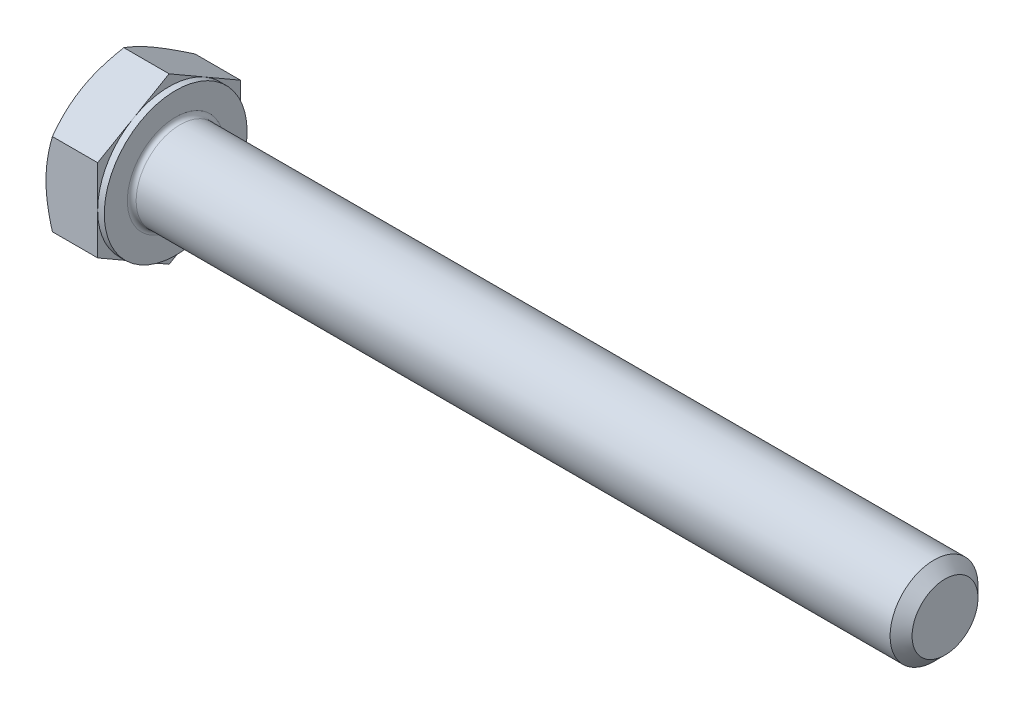
ISO-10303-21;
HEADER;
FILE_DESCRIPTION(('STEP AP214'),'2;1');
FILE_NAME('part.step','',(''),(''),'','','');
FILE_SCHEMA(('AUTOMOTIVE_DESIGN { 1 0 10303 214 1 1 1 1 }'));
ENDSEC;
DATA;
#1=APPLICATION_CONTEXT('core data for automotive mechanical design processes');
#2=APPLICATION_PROTOCOL_DEFINITION('international standard','automotive_design',2000,#1);
#3=PRODUCT_CONTEXT('',#1,'mechanical');
#4=PRODUCT('Part','Part','',(#3));
#5=PRODUCT_RELATED_PRODUCT_CATEGORY('part','',(#4));
#6=PRODUCT_DEFINITION_FORMATION('','',#4);
#7=PRODUCT_DEFINITION_CONTEXT('part definition',#1,'design');
#8=PRODUCT_DEFINITION('design','',#6,#7);
#9=PRODUCT_DEFINITION_SHAPE('','',#8);
#10=(LENGTH_UNIT() NAMED_UNIT(*) SI_UNIT(.MILLI.,.METRE.));
#11=(NAMED_UNIT(*) PLANE_ANGLE_UNIT() SI_UNIT($,.RADIAN.));
#12=(NAMED_UNIT(*) SI_UNIT($,.STERADIAN.) SOLID_ANGLE_UNIT());
#13=UNCERTAINTY_MEASURE_WITH_UNIT(LENGTH_MEASURE(1.E-05),#10,'distance_accuracy_value','');
#14=(GEOMETRIC_REPRESENTATION_CONTEXT(3) GLOBAL_UNCERTAINTY_ASSIGNED_CONTEXT((#13)) GLOBAL_UNIT_ASSIGNED_CONTEXT((#10,
#11,#12)) REPRESENTATION_CONTEXT('',''));
#15=CARTESIAN_POINT('',(0.,0.,0.));
#16=DIRECTION('',(0.,0.,1.));
#17=DIRECTION('',(1.,0.,0.));
#18=AXIS2_PLACEMENT_3D('',#15,#16,#17);
#19=CARTESIAN_POINT('',(5.3,3.75277674973256,-6.5));
#20=DIRECTION('',(0.,-0.866025403784438,0.500000000000001));
#21=DIRECTION('',(0.,-0.500000000000001,-0.866025403784438));
#22=AXIS2_PLACEMENT_3D('',#19,#20,#21);
#23=PLANE('',#22);
#24=DIRECTION('',(0.,0.500000000000001,0.866025403784438));
#25=VECTOR('',#24,1.);
#26=CARTESIAN_POINT('',(4.7,3.75277674973256,-6.5));
#27=LINE('',#26,#25);
#28=CARTESIAN_POINT('',(4.7,3.75277674973256,-6.5));
#29=VERTEX_POINT('',#28);
#30=CARTESIAN_POINT('',(4.7,5.62916512459885,-3.25));
#31=VERTEX_POINT('',#30);
#32=EDGE_CURVE('E178',#29,#31,#27,.T.);
#33=ORIENTED_EDGE('',*,*,#32,.F.);
#34=DIRECTION('',(-1.,0.,0.));
#35=VECTOR('',#34,1.);
#36=CARTESIAN_POINT('',(5.3,3.75277674973256,-6.5));
#37=LINE('',#36,#35);
#38=CARTESIAN_POINT('',(0.580556583600761,3.75277674973256,-6.5));
#39=VERTEX_POINT('',#38);
#40=EDGE_CURVE('E306',#29,#39,#37,.T.);
#41=ORIENTED_EDGE('',*,*,#40,.T.);
#42=CARTESIAN_POINT('',(0.580623251805869,7.50566896951898,0.0002));
#43=CARTESIAN_POINT('',(0.533004423075487,7.4231786300702,-0.14267745905888));
#44=CARTESIAN_POINT('',(0.487546700602708,7.34038072665458,-0.286087634534913));
#45=CARTESIAN_POINT('',(0.401548682023047,7.17411251123976,-0.574072631317195));
#46=CARTESIAN_POINT('',(0.361010507228027,7.09064192560665,-0.718647926571264));
#47=CARTESIAN_POINT('',(0.24757100112321,6.83889369625719,-1.15468865052003));
#48=CARTESIAN_POINT('',(0.183047807128741,6.66962231516081,-1.44787528284632));
#49=CARTESIAN_POINT('',(0.107386583547492,6.41631077211555,-1.88662374554437));
#50=CARTESIAN_POINT('',(0.0858328564569881,6.33302748139454,-2.03087463649469));
#51=CARTESIAN_POINT('',(0.0496903146061193,6.16608458377293,-2.32002821713809));
#52=CARTESIAN_POINT('',(0.0351008844596669,6.08242501078143,-2.46493084809889));
#53=CARTESIAN_POINT('',(0.0132587525073471,5.91496056339806,-2.75498777942832));
#54=CARTESIAN_POINT('',(0.00599772432210794,5.8311559625217,-2.90014160605421));
#55=CARTESIAN_POINT('',(-0.00103969741776869,5.66347396979287,-3.19057533697495));
#56=CARTESIAN_POINT('',(-0.000816322187795487,5.5795965802691,-3.33585523723636));
#57=CARTESIAN_POINT('',(0.010083458515165,5.34979921898453,-3.73387594242649));
#58=CARTESIAN_POINT('',(0.028381817869413,5.20395446807007,-3.98648646102757));
#59=CARTESIAN_POINT('',(0.0864063414576743,4.91323365606635,-4.49002967823568));
#60=CARTESIAN_POINT('',(0.126152338538243,4.76835861741226,-4.74096060593308));
#61=CARTESIAN_POINT('',(0.225505903202148,4.47705272008731,-5.24551722064432));
#62=CARTESIAN_POINT('',(0.285534425638025,4.33065861912702,-5.49907924143591));
#63=CARTESIAN_POINT('',(0.421774992509866,4.04005357906493,-6.00242193575904));
#64=CARTESIAN_POINT('',(0.497955034163591,3.89583891821181,-6.25220905555296));
#65=CARTESIAN_POINT('',(0.580623251805865,3.75266127967873,-6.5002));
#66=B_SPLINE_CURVE_WITH_KNOTS('',3,(#42,#43,#44,#45,#46,#47,#48,#49,#50,#51,#52,#53,#54,#55,#56,
#57,#58,#59,#60,#61,#62,#63,#64,#65),.UNSPECIFIED.,.F.,.F.,(4,2,2,2,2,2,2,2,2,2,2,4),(0.,
0.515105052395588,1.03043143507525,2.06322554824262,2.56697389547996,3.07067772176454,
3.57380860368928,4.0769239424252,4.9527935470566,5.82947446853466,6.72559912449737,
7.61996451221046),.UNSPECIFIED.);
#67=CARTESIAN_POINT('',(0.,5.62916512459885,-3.25000000000001));
#68=VERTEX_POINT('',#67);
#69=EDGE_CURVE('E233',#68,#39,#66,.T.);
#70=ORIENTED_EDGE('',*,*,#69,.F.);
#71=CARTESIAN_POINT('',(0.580556583600765,7.50555349946514,0.));
#72=VERTEX_POINT('',#71);
#73=EDGE_CURVE('E69',#72,#68,#66,.T.);
#74=ORIENTED_EDGE('',*,*,#73,.F.);
#75=DIRECTION('',(-1.,0.,0.));
#76=VECTOR('',#75,1.);
#77=CARTESIAN_POINT('',(5.3,7.50555349946514,0.));
#78=LINE('',#77,#76);
#79=CARTESIAN_POINT('',(4.7,7.50555349946514,0.));
#80=VERTEX_POINT('',#79);
#81=EDGE_CURVE('E298',#80,#72,#78,.T.);
#82=ORIENTED_EDGE('',*,*,#81,.F.);
#83=EDGE_CURVE('E176',#31,#80,#27,.T.);
#84=ORIENTED_EDGE('',*,*,#83,.F.);
#85=EDGE_LOOP('',(#33,#41,#70,#74,#82,#84));
#86=FACE_BOUND('',#85,.T.);
#87=ADVANCED_FACE('F46',(#86),#23,.F.);
#88=CARTESIAN_POINT('',(5.3,7.50555349946514,0.));
#89=DIRECTION('',(0.,-0.866025403784438,-0.500000000000001));
#90=DIRECTION('',(0.,0.500000000000001,-0.866025403784438));
#91=AXIS2_PLACEMENT_3D('',#88,#89,#90);
#92=PLANE('',#91);
#93=DIRECTION('',(0.,-0.500000000000001,0.866025403784438));
#94=VECTOR('',#93,1.);
#95=CARTESIAN_POINT('',(4.7,7.50555349946514,0.));
#96=LINE('',#95,#94);
#97=CARTESIAN_POINT('',(4.7,5.62916512459885,3.25000000000001));
#98=VERTEX_POINT('',#97);
#99=EDGE_CURVE('E175',#80,#98,#96,.T.);
#100=ORIENTED_EDGE('',*,*,#99,.F.);
#101=ORIENTED_EDGE('',*,*,#81,.T.);
#102=CARTESIAN_POINT('',(0.580623251805865,3.75266127967872,6.5002));
#103=CARTESIAN_POINT('',(0.533004423075483,3.8351516191275,6.35732254094112));
#104=CARTESIAN_POINT('',(0.487546700602704,3.91794952254312,6.21391236546509));
#105=CARTESIAN_POINT('',(0.401548682023044,4.08421773795794,5.9259273686828));
#106=CARTESIAN_POINT('',(0.361010507228023,4.16768832359105,5.78135207342873));
#107=CARTESIAN_POINT('',(0.247571001123207,4.41943655294051,5.34531134947996));
#108=CARTESIAN_POINT('',(0.183047807128738,4.58870793403689,5.05212471715368));
#109=CARTESIAN_POINT('',(0.10738658354749,4.84201947708215,4.61337625445563));
#110=CARTESIAN_POINT('',(0.0858328564569865,4.92530276780316,4.46912536350531));
#111=CARTESIAN_POINT('',(0.0496903146061183,5.09224566542477,4.17997178286191));
#112=CARTESIAN_POINT('',(0.035100884459666,5.17590523841627,4.03506915190111));
#113=CARTESIAN_POINT('',(0.0132587525073465,5.34336968579964,3.74501222057168));
#114=CARTESIAN_POINT('',(0.00599772432210779,5.427174286676,3.59985839394579));
#115=CARTESIAN_POINT('',(-0.00103969741776854,5.59485627940483,3.30942466302505));
#116=CARTESIAN_POINT('',(-0.000816322187795452,5.6787336689286,3.16414476276364));
#117=CARTESIAN_POINT('',(0.010083458515165,5.90853103021317,2.76612405757351));
#118=CARTESIAN_POINT('',(0.0283818178694132,6.05437578112763,2.51351353897243));
#119=CARTESIAN_POINT('',(0.0864063414576753,6.34509659313135,2.00997032176432));
#120=CARTESIAN_POINT('',(0.126152338538245,6.48997163178545,1.75903939406692));
#121=CARTESIAN_POINT('',(0.22550590320215,6.78127752911039,1.25448277935568));
#122=CARTESIAN_POINT('',(0.285534425638028,6.92767163007068,1.00092075856409));
#123=CARTESIAN_POINT('',(0.42177499250987,7.21827667013277,0.497578064240955));
#124=CARTESIAN_POINT('',(0.497955034163595,7.36249133098589,0.247790944447036));
#125=CARTESIAN_POINT('',(0.580623251805869,7.50566896951898,-0.000200000000000213));
#126=B_SPLINE_CURVE_WITH_KNOTS('',3,(#102,#103,#104,#105,#106,#107,#108,#109,#110,#111,#112,
#113,#114,#115,#116,#117,#118,#119,#120,#121,#122,#123,#124,#125),.UNSPECIFIED.,.F.,.F.,(4,2,2,
2,2,2,2,2,2,2,2,4),(0.,0.515105052395587,1.03043143507524,2.06322554824262,2.56697389547996,
3.07067772176454,3.57380860368928,4.0769239424252,4.9527935470566,5.82947446853466,
6.72559912449737,7.61996451221046),.UNSPECIFIED.);
#127=CARTESIAN_POINT('',(0.,5.62916512459885,3.25000000000001));
#128=VERTEX_POINT('',#127);
#129=EDGE_CURVE('E230',#128,#72,#126,.T.);
#130=ORIENTED_EDGE('',*,*,#129,.F.);
#131=CARTESIAN_POINT('',(0.58055658360076,3.75277674973256,6.5));
#132=VERTEX_POINT('',#131);
#133=EDGE_CURVE('E244',#132,#128,#126,.T.);
#134=ORIENTED_EDGE('',*,*,#133,.F.);
#135=DIRECTION('',(-1.,0.,0.));
#136=VECTOR('',#135,1.);
#137=CARTESIAN_POINT('',(5.3,3.75277674973256,6.5));
#138=LINE('',#137,#136);
#139=CARTESIAN_POINT('',(4.7,3.75277674973256,6.5));
#140=VERTEX_POINT('',#139);
#141=EDGE_CURVE('E300',#140,#132,#138,.T.);
#142=ORIENTED_EDGE('',*,*,#141,.F.);
#143=EDGE_CURVE('E143',#98,#140,#96,.T.);
#144=ORIENTED_EDGE('',*,*,#143,.F.);
#145=EDGE_LOOP('',(#100,#101,#130,#134,#142,#144));
#146=FACE_BOUND('',#145,.T.);
#147=ADVANCED_FACE('F251',(#146),#92,.F.);
#148=CARTESIAN_POINT('',(5.3,3.75277674973256,6.5));
#149=DIRECTION('',(0.,0.,-1.));
#150=DIRECTION('',(0.,1.,0.));
#151=AXIS2_PLACEMENT_3D('',#148,#149,#150);
#152=PLANE('',#151);
#153=DIRECTION('',(0.,-1.,0.));
#154=VECTOR('',#153,1.);
#155=CARTESIAN_POINT('',(4.7,3.75277674973256,6.5));
#156=LINE('',#155,#154);
#157=CARTESIAN_POINT('',(4.7,0.,6.5));
#158=VERTEX_POINT('',#157);
#159=EDGE_CURVE('E137',#140,#158,#156,.T.);
#160=ORIENTED_EDGE('',*,*,#159,.F.);
#161=ORIENTED_EDGE('',*,*,#141,.T.);
#162=CARTESIAN_POINT('',(3.18835311590246,-10.1137456678934,6.5));
#163=CARTESIAN_POINT('',(3.05034774010468,-9.82952666322138,6.5));
#164=CARTESIAN_POINT('',(2.91365616489938,-9.54465869649274,6.5));
#165=CARTESIAN_POINT('',(2.64363899497541,-8.97327978057922,6.5));
#166=CARTESIAN_POINT('',(2.51031392459097,-8.68676858388472,6.5));
#167=CARTESIAN_POINT('',(2.24710473482719,-8.11029837842689,6.5));
#168=CARTESIAN_POINT('',(2.1172430043868,-7.82032911201512,6.5));
#169=CARTESIAN_POINT('',(1.86279082826903,-7.2380954102234,6.5));
#170=CARTESIAN_POINT('',(1.73820013554674,-6.94583108317207,6.5));
#171=CARTESIAN_POINT('',(1.49176685426961,-6.34906440963036,6.5));
#172=CARTESIAN_POINT('',(1.37014257641265,-6.04447142288872,6.5));
#173=CARTESIAN_POINT('',(1.13601865758149,-5.43173420957315,6.5));
#174=CARTESIAN_POINT('',(1.02352003558022,-5.12358959079846,6.5));
#175=CARTESIAN_POINT('',(0.810575368239917,-4.5038256978226,6.5));
#176=CARTESIAN_POINT('',(0.710105232302005,-4.19221478266993,6.5));
#177=CARTESIAN_POINT('',(0.524420166144454,-3.56452019206012,6.5));
#178=CARTESIAN_POINT('',(0.439200468206418,-3.24843794792921,6.5));
#179=CARTESIAN_POINT('',(0.288524223401198,-2.61335465712783,6.5));
#180=CARTESIAN_POINT('',(0.222961865744749,-2.29437912059505,6.5));
#181=CARTESIAN_POINT('',(0.115312883130725,-1.65238219405863,6.5));
#182=CARTESIAN_POINT('',(0.0732239014690639,-1.3293612135443,6.5));
#183=CARTESIAN_POINT('',(0.0304887136381667,-0.845231171839986,6.5));
#184=CARTESIAN_POINT('',(0.0196493434273843,-0.684982209663103,6.5));
#185=CARTESIAN_POINT('',(0.00475298486143982,-0.36416234906546,6.5));
#186=CARTESIAN_POINT('',(0.000695882908832042,-0.203591456081879,6.5));
#187=CARTESIAN_POINT('',(-0.000531597190094996,0.117577430374297,6.5));
#188=CARTESIAN_POINT('',(0.00229809017012694,0.278175424090143,6.5));
#189=CARTESIAN_POINT('',(0.0147726845547639,0.599108972823505,6.5));
#190=CARTESIAN_POINT('',(0.0244179260500518,0.759444514574217,6.5));
#191=CARTESIAN_POINT('',(0.0554961939343001,1.14369946602534,6.5));
#192=CARTESIAN_POINT('',(0.0801030490514518,1.36736763045086,6.5));
#193=CARTESIAN_POINT('',(0.141246537453378,1.81305591311688,6.5));
#194=CARTESIAN_POINT('',(0.177784759614452,2.03507580783108,6.5));
#195=CARTESIAN_POINT('',(0.303360001332115,2.69839633433796,6.5));
#196=CARTESIAN_POINT('',(0.408335815147595,3.13672010374357,6.5));
#197=CARTESIAN_POINT('',(0.59056459313494,3.79232112918118,6.5));
#198=CARTESIAN_POINT('',(0.656313198979091,4.01299150874073,6.5));
#199=CARTESIAN_POINT('',(0.794681634200732,4.45218859008391,6.5));
#200=CARTESIAN_POINT('',(0.867301513122617,4.67071527639819,6.5));
#201=CARTESIAN_POINT('',(1.01824353854295,5.10569490252726,6.5));
#202=CARTESIAN_POINT('',(1.09656388232839,5.32214847365075,6.5));
#203=CARTESIAN_POINT('',(1.25798086164821,5.75325725773039,6.5));
#204=CARTESIAN_POINT('',(1.34107741035995,5.96791250329556,6.5));
#205=CARTESIAN_POINT('',(1.56029019583041,6.51888445936372,6.5));
#206=CARTESIAN_POINT('',(1.69936356666534,6.85402316813627,6.5));
#207=CARTESIAN_POINT('',(1.98501958087353,7.52109583939393,6.5));
#208=CARTESIAN_POINT('',(2.13160288780791,7.85302951559933,6.5));
#209=CARTESIAN_POINT('',(2.43059748044951,8.51437865518657,6.5));
#210=CARTESIAN_POINT('',(2.58301057596959,8.84379329784093,6.5));
#211=CARTESIAN_POINT('',(2.89234869374926,9.50047798683784,6.5));
#212=CARTESIAN_POINT('',(3.04927357220058,9.82774810112757,6.5));
#213=CARTESIAN_POINT('',(3.36692013130636,10.4809971975748,6.5));
#214=CARTESIAN_POINT('',(3.52764676491733,10.8069737667408,6.5));
#215=CARTESIAN_POINT('',(3.85198555554899,11.4574882901034,6.5));
#216=CARTESIAN_POINT('',(4.01559773123065,11.7820262349792,6.5));
#217=CARTESIAN_POINT('',(4.50986185003773,12.7537468114441,6.5));
#218=CARTESIAN_POINT('',(4.84399997978541,13.3991555932469,6.5));
#219=CARTESIAN_POINT('',(5.48575990265919,14.6239779290894,6.5));
#220=CARTESIAN_POINT('',(5.79279643372278,15.2036995760604,6.5));
#221=CARTESIAN_POINT('',(6.4106918822763,16.3611382637875,6.5));
#222=CARTESIAN_POINT('',(6.72155099010109,16.938855202873,6.5));
#223=CARTESIAN_POINT('',(7.34519775439014,18.0910273555999,6.5));
#224=CARTESIAN_POINT('',(7.65797694168864,18.665487160613,6.5));
#225=CARTESIAN_POINT('',(8.28574397153078,19.8131486204439,6.5));
#226=CARTESIAN_POINT('',(8.60073166294279,20.3863503578957,6.5));
#227=CARTESIAN_POINT('',(8.91652967168741,20.9591024521449,6.5));
#228=B_SPLINE_CURVE_WITH_KNOTS('',3,(#162,#163,#164,#165,#166,#167,#168,#169,#170,#171,#172,
#173,#174,#175,#176,#177,#178,#179,#180,#181,#182,#183,#184,#185,#186,#187,#188,#189,#190,#191,
#192,#193,#194,#195,#196,#197,#198,#199,#200,#201,#202,#203,#204,#205,#206,#207,#208,#209,#210,
#211,#212,#213,#214,#215,#216,#217,#218,#219,#220,#221,#222,#223,#224,#225,#226,#227),
.UNSPECIFIED.,.F.,.F.,(4,2,2,2,2,2,2,2,2,2,2,2,2,2,2,2,2,2,2,2,2,2,2,2,2,2,2,2,2,2,2,2,4),(0.,
0.947868666702312,1.89588406483492,2.84900320930536,3.80207763304315,4.78589774082711,
5.76982755141752,6.75175256246685,7.73337005764394,8.70960474890991,9.68574140951124,
10.1674651053568,10.6491807326436,11.1309009419855,11.6126447932157,12.287317572382,
12.9620802330383,14.312318438093,15.0030310344276,15.6937486114326,16.3842486973571,
17.0747362352244,18.1631508683747,19.2516618378194,20.3405135142583,21.4293305231019,
22.5196540547637,23.6099846401957,25.7902468235016,27.7582608872418,29.7263733429304,
31.6886408595598,33.6507753806319),.UNSPECIFIED.);
#229=CARTESIAN_POINT('',(0.,0.,6.5));
#230=VERTEX_POINT('',#229);
#231=EDGE_CURVE('E245',#230,#132,#228,.T.);
#232=ORIENTED_EDGE('',*,*,#231,.F.);
#233=CARTESIAN_POINT('',(0.580556583600765,-3.75277674973258,6.5));
#234=VERTEX_POINT('',#233);
#235=EDGE_CURVE('E307',#234,#230,#228,.T.);
#236=ORIENTED_EDGE('',*,*,#235,.F.);
#237=DIRECTION('',(-1.,0.,0.));
#238=VECTOR('',#237,1.);
#239=CARTESIAN_POINT('',(5.3,-3.75277674973258,6.5));
#240=LINE('',#239,#238);
#241=CARTESIAN_POINT('',(4.7,-3.75277674973258,6.5));
#242=VERTEX_POINT('',#241);
#243=EDGE_CURVE('E169',#242,#234,#240,.T.);
#244=ORIENTED_EDGE('',*,*,#243,.F.);
#245=EDGE_CURVE('E147',#158,#242,#156,.T.);
#246=ORIENTED_EDGE('',*,*,#245,.F.);
#247=EDGE_LOOP('',(#160,#161,#232,#236,#244,#246));
#248=FACE_BOUND('',#247,.T.);
#249=ADVANCED_FACE('F167',(#248),#152,.F.);
#250=CARTESIAN_POINT('',(5.3,-7.50555349946515,0.));
#251=DIRECTION('',(0.,0.866025403784438,-0.500000000000001));
#252=DIRECTION('',(0.,0.500000000000001,0.866025403784438));
#253=AXIS2_PLACEMENT_3D('',#250,#251,#252);
#254=PLANE('',#253);
#255=DIRECTION('',(0.,-0.500000000000001,-0.866025403784438));
#256=VECTOR('',#255,1.);
#257=CARTESIAN_POINT('',(4.7,-7.50555349946515,0.));
#258=LINE('',#257,#256);
#259=CARTESIAN_POINT('',(4.7,-5.62916512459885,3.25));
#260=VERTEX_POINT('',#259);
#261=EDGE_CURVE('E154',#242,#260,#258,.T.);
#262=ORIENTED_EDGE('',*,*,#261,.F.);
#263=ORIENTED_EDGE('',*,*,#243,.T.);
#264=CARTESIAN_POINT('',(0.580623251805877,-7.50566896951899,-0.000199999999999834));
#265=CARTESIAN_POINT('',(0.533004423075495,-7.42317863007021,0.14267745905888));
#266=CARTESIAN_POINT('',(0.487546700602716,-7.3403807266546,0.286087634534913));
#267=CARTESIAN_POINT('',(0.401548682023055,-7.17411251123977,0.574072631317195));
#268=CARTESIAN_POINT('',(0.361010507228034,-7.09064192560666,0.718647926571265));
#269=CARTESIAN_POINT('',(0.247571001123217,-6.8388936962572,1.15468865052004));
#270=CARTESIAN_POINT('',(0.183047807128748,-6.66962231516082,1.44787528284632));
#271=CARTESIAN_POINT('',(0.107386583547499,-6.41631077211556,1.88662374554438));
#272=CARTESIAN_POINT('',(0.0858328564569948,-6.33302748139455,2.03087463649469));
#273=CARTESIAN_POINT('',(0.049690314606126,-6.16608458377294,2.32002821713809));
#274=CARTESIAN_POINT('',(0.0351008844596736,-6.08242501078144,2.46493084809889));
#275=CARTESIAN_POINT('',(0.0132587525073536,-5.91496056339808,2.75498777942833));
#276=CARTESIAN_POINT('',(0.00599772432211453,-5.83115596252171,2.90014160605422));
#277=CARTESIAN_POINT('',(-0.001039697417762,-5.66347396979288,3.19057533697495));
#278=CARTESIAN_POINT('',(-0.000816322187788739,-5.57959658026911,3.33585523723636));
#279=CARTESIAN_POINT('',(0.0100834585151718,-5.34979921898454,3.7338759424265));
#280=CARTESIAN_POINT('',(0.0283818178694196,-5.20395446807008,3.98648646102758));
#281=CARTESIAN_POINT('',(0.0864063414576807,-4.91323365606637,4.49002967823568));
#282=CARTESIAN_POINT('',(0.12615233853825,-4.76835861741227,4.74096060593309));
#283=CARTESIAN_POINT('',(0.225505903202154,-4.47705272008733,5.24551722064432));
#284=CARTESIAN_POINT('',(0.28553442563803,-4.33065861912704,5.49907924143592));
#285=CARTESIAN_POINT('',(0.421774992509871,-4.04005357906495,6.00242193575905));
#286=CARTESIAN_POINT('',(0.497955034163595,-3.89583891821182,6.25220905555296));
#287=CARTESIAN_POINT('',(0.580623251805869,-3.75266127967874,6.5002));
#288=B_SPLINE_CURVE_WITH_KNOTS('',3,(#264,#265,#266,#267,#268,#269,#270,#271,#272,#273,#274,
#275,#276,#277,#278,#279,#280,#281,#282,#283,#284,#285,#286,#287),.UNSPECIFIED.,.F.,.F.,(4,2,2,
2,2,2,2,2,2,2,2,4),(0.,0.515105052395588,1.03043143507525,2.06322554824263,2.56697389547997,
3.07067772176454,3.57380860368929,4.07692394242521,4.95279354705661,5.82947446853467,
6.72559912449737,7.61996451221046),.UNSPECIFIED.);
#289=CARTESIAN_POINT('',(0.,-5.62916512459885,3.25000000000001));
#290=VERTEX_POINT('',#289);
#291=EDGE_CURVE('E232',#290,#234,#288,.T.);
#292=ORIENTED_EDGE('',*,*,#291,.F.);
#293=CARTESIAN_POINT('',(0.580556583600772,-7.50555349946515,0.));
#294=VERTEX_POINT('',#293);
#295=EDGE_CURVE('E224',#294,#290,#288,.T.);
#296=ORIENTED_EDGE('',*,*,#295,.F.);
#297=DIRECTION('',(-1.,0.,0.));
#298=VECTOR('',#297,1.);
#299=CARTESIAN_POINT('',(5.3,-7.50555349946515,0.));
#300=LINE('',#299,#298);
#301=CARTESIAN_POINT('',(4.7,-7.50555349946515,0.));
#302=VERTEX_POINT('',#301);
#303=EDGE_CURVE('E303',#302,#294,#300,.T.);
#304=ORIENTED_EDGE('',*,*,#303,.F.);
#305=EDGE_CURVE('E170',#260,#302,#258,.T.);
#306=ORIENTED_EDGE('',*,*,#305,.F.);
#307=EDGE_LOOP('',(#262,#263,#292,#296,#304,#306));
#308=FACE_BOUND('',#307,.T.);
#309=ADVANCED_FACE('F215',(#308),#254,.F.);
#310=CARTESIAN_POINT('',(5.3,-3.75277674973258,-6.5));
#311=DIRECTION('',(0.,0.866025403784438,0.500000000000001));
#312=DIRECTION('',(0.,-0.500000000000001,0.866025403784438));
#313=AXIS2_PLACEMENT_3D('',#310,#311,#312);
#314=PLANE('',#313);
#315=DIRECTION('',(0.,0.500000000000001,-0.866025403784438));
#316=VECTOR('',#315,1.);
#317=CARTESIAN_POINT('',(4.7,-3.75277674973258,-6.5));
#318=LINE('',#317,#316);
#319=CARTESIAN_POINT('',(4.7,-5.62916512459885,-3.25));
#320=VERTEX_POINT('',#319);
#321=EDGE_CURVE('E353',#302,#320,#318,.T.);
#322=ORIENTED_EDGE('',*,*,#321,.F.);
#323=ORIENTED_EDGE('',*,*,#303,.T.);
#324=CARTESIAN_POINT('',(0.580623251805869,-3.75266127967874,-6.5002));
#325=CARTESIAN_POINT('',(0.533004423075488,-3.83515161912751,-6.35732254094112));
#326=CARTESIAN_POINT('',(0.487546700602708,-3.91794952254313,-6.21391236546509));
#327=CARTESIAN_POINT('',(0.401548682023049,-4.08421773795795,-5.92592736868281));
#328=CARTESIAN_POINT('',(0.361010507228029,-4.16768832359106,-5.78135207342874));
#329=CARTESIAN_POINT('',(0.247571001123213,-4.41943655294052,-5.34531134947997));
#330=CARTESIAN_POINT('',(0.183047807128744,-4.58870793403691,-5.05212471715368));
#331=CARTESIAN_POINT('',(0.107386583547496,-4.84201947708216,-4.61337625445563));
#332=CARTESIAN_POINT('',(0.085832856456992,-4.92530276780317,-4.46912536350531));
#333=CARTESIAN_POINT('',(0.0496903146061239,-5.09224566542478,-4.17997178286191));
#334=CARTESIAN_POINT('',(0.035100884459672,-5.17590523841629,-4.03506915190111));
#335=CARTESIAN_POINT('',(0.0132587525073528,-5.34336968579965,-3.74501222057168));
#336=CARTESIAN_POINT('',(0.00599772432211393,-5.42717428667601,-3.59985839394579));
#337=CARTESIAN_POINT('',(-0.00103969741776215,-5.59485627940485,-3.30942466302505));
#338=CARTESIAN_POINT('',(-0.000816322187788696,-5.67873366892861,-3.16414476276364));
#339=CARTESIAN_POINT('',(0.0100834585151724,-5.90853103021318,-2.76612405757351));
#340=CARTESIAN_POINT('',(0.0283818178694207,-6.05437578112765,-2.51351353897243));
#341=CARTESIAN_POINT('',(0.086406341457683,-6.34509659313136,-2.00997032176432));
#342=CARTESIAN_POINT('',(0.126152338538253,-6.48997163178546,-1.75903939406692));
#343=CARTESIAN_POINT('',(0.225505903202158,-6.7812775291104,-1.25448277935568));
#344=CARTESIAN_POINT('',(0.285534425638035,-6.92767163007069,-1.00092075856409));
#345=CARTESIAN_POINT('',(0.421774992509877,-7.21827667013278,-0.497578064240955));
#346=CARTESIAN_POINT('',(0.497955034163602,-7.3624913309859,-0.247790944447036));
#347=CARTESIAN_POINT('',(0.580623251805876,-7.50566896951899,0.000199999999999993));
#348=B_SPLINE_CURVE_WITH_KNOTS('',3,(#324,#325,#326,#327,#328,#329,#330,#331,#332,#333,#334,
#335,#336,#337,#338,#339,#340,#341,#342,#343,#344,#345,#346,#347),.UNSPECIFIED.,.F.,.F.,(4,2,2,
2,2,2,2,2,2,2,2,4),(0.,0.515105052395587,1.03043143507524,2.06322554824262,2.56697389547996,
3.07067772176454,3.57380860368928,4.0769239424252,4.9527935470566,5.82947446853466,
6.72559912449736,7.61996451221046),.UNSPECIFIED.);
#349=CARTESIAN_POINT('',(0.,-5.62916512459885,-3.25));
#350=VERTEX_POINT('',#349);
#351=EDGE_CURVE('E231',#350,#294,#348,.T.);
#352=ORIENTED_EDGE('',*,*,#351,.F.);
#353=CARTESIAN_POINT('',(0.580556583600765,-3.75277674973258,-6.5));
#354=VERTEX_POINT('',#353);
#355=EDGE_CURVE('E192',#354,#350,#348,.T.);
#356=ORIENTED_EDGE('',*,*,#355,.F.);
#357=DIRECTION('',(-1.,0.,0.));
#358=VECTOR('',#357,1.);
#359=CARTESIAN_POINT('',(5.3,-3.75277674973258,-6.5));
#360=LINE('',#359,#358);
#361=CARTESIAN_POINT('',(4.7,-3.75277674973258,-6.5));
#362=VERTEX_POINT('',#361);
#363=EDGE_CURVE('E305',#362,#354,#360,.T.);
#364=ORIENTED_EDGE('',*,*,#363,.F.);
#365=EDGE_CURVE('E165',#320,#362,#318,.T.);
#366=ORIENTED_EDGE('',*,*,#365,.F.);
#367=EDGE_LOOP('',(#322,#323,#352,#356,#364,#366));
#368=FACE_BOUND('',#367,.T.);
#369=ADVANCED_FACE('F208',(#368),#314,.F.);
#370=CARTESIAN_POINT('',(5.3,3.75277674973256,-6.5));
#371=DIRECTION('',(0.,0.,1.));
#372=DIRECTION('',(0.,-1.,0.));
#373=AXIS2_PLACEMENT_3D('',#370,#371,#372);
#374=PLANE('',#373);
#375=DIRECTION('',(0.,1.,0.));
#376=VECTOR('',#375,1.);
#377=CARTESIAN_POINT('',(4.7,3.75277674973256,-6.5));
#378=LINE('',#377,#376);
#379=CARTESIAN_POINT('',(4.7,0.,-6.5));
#380=VERTEX_POINT('',#379);
#381=EDGE_CURVE('E277',#362,#380,#378,.T.);
#382=ORIENTED_EDGE('',*,*,#381,.F.);
#383=ORIENTED_EDGE('',*,*,#363,.T.);
#384=CARTESIAN_POINT('',(3.18835311590246,-10.1137456678934,-6.5));
#385=CARTESIAN_POINT('',(3.05034774010468,-9.82952666322138,-6.5));
#386=CARTESIAN_POINT('',(2.91365616489938,-9.54465869649274,-6.5));
#387=CARTESIAN_POINT('',(2.64363899497542,-8.97327978057922,-6.5));
#388=CARTESIAN_POINT('',(2.51031392459097,-8.68676858388472,-6.5));
#389=CARTESIAN_POINT('',(2.24710473482719,-8.11029837842689,-6.5));
#390=CARTESIAN_POINT('',(2.1172430043868,-7.82032911201512,-6.5));
#391=CARTESIAN_POINT('',(1.86279082826903,-7.2380954102234,-6.5));
#392=CARTESIAN_POINT('',(1.73820013554675,-6.94583108317207,-6.5));
#393=CARTESIAN_POINT('',(1.49176685426962,-6.34906440963036,-6.5));
#394=CARTESIAN_POINT('',(1.37014257641266,-6.04447142288872,-6.5));
#395=CARTESIAN_POINT('',(1.13601865758149,-5.43173420957316,-6.5));
#396=CARTESIAN_POINT('',(1.02352003558022,-5.12358959079846,-6.5));
#397=CARTESIAN_POINT('',(0.810575368239919,-4.5038256978226,-6.5));
#398=CARTESIAN_POINT('',(0.710105232302007,-4.19221478266993,-6.5));
#399=CARTESIAN_POINT('',(0.524420166144455,-3.56452019206012,-6.5));
#400=CARTESIAN_POINT('',(0.439200468206419,-3.24843794792921,-6.5));
#401=CARTESIAN_POINT('',(0.288524223401198,-2.61335465712783,-6.5));
#402=CARTESIAN_POINT('',(0.222961865744749,-2.29437912059505,-6.5));
#403=CARTESIAN_POINT('',(0.115312883130726,-1.65238219405862,-6.5));
#404=CARTESIAN_POINT('',(0.0732239014690635,-1.3293612135443,-6.5));
#405=CARTESIAN_POINT('',(0.0304887136381666,-0.845231171839984,-6.5));
#406=CARTESIAN_POINT('',(0.0196493434273846,-0.684982209663101,-6.5));
#407=CARTESIAN_POINT('',(0.0047529848614402,-0.364162349065459,-6.5));
#408=CARTESIAN_POINT('',(0.000695882908832254,-0.203591456081878,-6.5));
#409=CARTESIAN_POINT('',(-0.000531597190094705,0.117577430374298,-6.5));
#410=CARTESIAN_POINT('',(0.00229809017012751,0.278175424090144,-6.5));
#411=CARTESIAN_POINT('',(0.0147726845547647,0.599108972823507,-6.5));
#412=CARTESIAN_POINT('',(0.0244179260500526,0.759444514574219,-6.5));
#413=CARTESIAN_POINT('',(0.0554961939343006,1.14369946602534,-6.5));
#414=CARTESIAN_POINT('',(0.0801030490514521,1.36736763045086,-6.5));
#415=CARTESIAN_POINT('',(0.141246537453378,1.81305591311688,-6.5));
#416=CARTESIAN_POINT('',(0.177784759614452,2.03507580783108,-6.5));
#417=CARTESIAN_POINT('',(0.303360001332115,2.69839633433795,-6.5));
#418=CARTESIAN_POINT('',(0.408335815147594,3.13672010374357,-6.5));
#419=CARTESIAN_POINT('',(0.59056459313494,3.79232112918118,-6.5));
#420=CARTESIAN_POINT('',(0.656313198979091,4.01299150874073,-6.5));
#421=CARTESIAN_POINT('',(0.794681634200732,4.45218859008391,-6.5));
#422=CARTESIAN_POINT('',(0.867301513122617,4.67071527639819,-6.5));
#423=CARTESIAN_POINT('',(1.01824353854295,5.10569490252726,-6.5));
#424=CARTESIAN_POINT('',(1.09656388232839,5.32214847365075,-6.5));
#425=CARTESIAN_POINT('',(1.25798086164821,5.75325725773039,-6.5));
#426=CARTESIAN_POINT('',(1.34107741035995,5.96791250329556,-6.5));
#427=CARTESIAN_POINT('',(1.56029019583041,6.51888445936372,-6.5));
#428=CARTESIAN_POINT('',(1.69936356666534,6.85402316813626,-6.5));
#429=CARTESIAN_POINT('',(1.98501958087353,7.52109583939393,-6.5));
#430=CARTESIAN_POINT('',(2.13160288780791,7.85302951559933,-6.5));
#431=CARTESIAN_POINT('',(2.43059748044951,8.51437865518657,-6.5));
#432=CARTESIAN_POINT('',(2.58301057596959,8.84379329784094,-6.5));
#433=CARTESIAN_POINT('',(2.89234869374926,9.50047798683784,-6.5));
#434=CARTESIAN_POINT('',(3.04927357220059,9.82774810112757,-6.5));
#435=CARTESIAN_POINT('',(3.36692013130636,10.4809971975748,-6.5));
#436=CARTESIAN_POINT('',(3.52764676491733,10.8069737667408,-6.5));
#437=CARTESIAN_POINT('',(3.85198555554899,11.4574882901034,-6.5));
#438=CARTESIAN_POINT('',(4.01559773123066,11.7820262349792,-6.5));
#439=CARTESIAN_POINT('',(4.50986185003773,12.7537468114441,-6.5));
#440=CARTESIAN_POINT('',(4.84399997978541,13.3991555932469,-6.5));
#441=CARTESIAN_POINT('',(5.48575990265919,14.6239779290894,-6.5));
#442=CARTESIAN_POINT('',(5.79279643372279,15.2036995760604,-6.5));
#443=CARTESIAN_POINT('',(6.4106918822763,16.3611382637875,-6.5));
#444=CARTESIAN_POINT('',(6.72155099010109,16.938855202873,-6.5));
#445=CARTESIAN_POINT('',(7.34519775439015,18.0910273555999,-6.5));
#446=CARTESIAN_POINT('',(7.65797694168864,18.665487160613,-6.5));
#447=CARTESIAN_POINT('',(8.28574397153078,19.8131486204439,-6.5));
#448=CARTESIAN_POINT('',(8.60073166294279,20.3863503578957,-6.5));
#449=CARTESIAN_POINT('',(8.91652967168742,20.9591024521449,-6.49999999999999));
#450=B_SPLINE_CURVE_WITH_KNOTS('',3,(#384,#385,#386,#387,#388,#389,#390,#391,#392,#393,#394,
#395,#396,#397,#398,#399,#400,#401,#402,#403,#404,#405,#406,#407,#408,#409,#410,#411,#412,#413,
#414,#415,#416,#417,#418,#419,#420,#421,#422,#423,#424,#425,#426,#427,#428,#429,#430,#431,#432,
#433,#434,#435,#436,#437,#438,#439,#440,#441,#442,#443,#444,#445,#446,#447,#448,#449),
.UNSPECIFIED.,.F.,.F.,(4,2,2,2,2,2,2,2,2,2,2,2,2,2,2,2,2,2,2,2,2,2,2,2,2,2,2,2,2,2,2,2,4),(0.,
0.947868666702312,1.89588406483492,2.84900320930536,3.80207763304314,4.7858977408271,
5.76982755141752,6.75175256246685,7.73337005764394,8.70960474890992,9.68574140951124,
10.1674651053568,10.6491807326436,11.1309009419855,11.6126447932157,12.287317572382,
12.9620802330384,14.312318438093,15.0030310344276,15.6937486114326,16.3842486973571,
17.0747362352244,18.1631508683747,19.2516618378194,20.3405135142583,21.4293305231019,
22.5196540547637,23.6099846401957,25.7902468235017,27.7582608872418,29.7263733429304,
31.6886408595598,33.6507753806319),.UNSPECIFIED.);
#451=CARTESIAN_POINT('',(0.,0.,-6.5));
#452=VERTEX_POINT('',#451);
#453=EDGE_CURVE('E182',#452,#354,#450,.F.);
#454=ORIENTED_EDGE('',*,*,#453,.F.);
#455=EDGE_CURVE('E191',#39,#452,#450,.F.);
#456=ORIENTED_EDGE('',*,*,#455,.F.);
#457=ORIENTED_EDGE('',*,*,#40,.F.);
#458=EDGE_CURVE('E281',#380,#29,#378,.T.);
#459=ORIENTED_EDGE('',*,*,#458,.F.);
#460=EDGE_LOOP('',(#382,#383,#454,#456,#457,#459));
#461=FACE_BOUND('',#460,.T.);
#462=ADVANCED_FACE('F203',(#461),#374,.F.);
#463=CARTESIAN_POINT('',(0.,0.,0.));
#464=DIRECTION('',(1.,0.,0.));
#465=DIRECTION('',(0.,0.,-1.));
#466=AXIS2_PLACEMENT_3D('',#463,#464,#465);
#467=CONICAL_SURFACE('',#466,6.5,1.0471975511966);
#468=ORIENTED_EDGE('',*,*,#355,.T.);
#469=CARTESIAN_POINT('',(0.,0.,0.));
#470=DIRECTION('',(1.,0.,0.));
#471=DIRECTION('',(0.,0.,-1.));
#472=AXIS2_PLACEMENT_3D('',#469,#470,#471);
#473=CIRCLE('',#472,6.5);
#474=EDGE_CURVE('E294',#350,#452,#473,.T.);
#475=ORIENTED_EDGE('',*,*,#474,.T.);
#476=ORIENTED_EDGE('',*,*,#453,.T.);
#477=EDGE_LOOP('',(#468,#475,#476));
#478=FACE_BOUND('',#477,.T.);
#479=ADVANCED_FACE('F207',(#478),#467,.T.);
#480=ORIENTED_EDGE('',*,*,#295,.T.);
#481=EDGE_CURVE('E297',#290,#350,#473,.T.);
#482=ORIENTED_EDGE('',*,*,#481,.T.);
#483=ORIENTED_EDGE('',*,*,#351,.T.);
#484=EDGE_LOOP('',(#480,#482,#483));
#485=FACE_BOUND('',#484,.T.);
#486=ADVANCED_FACE('F350',(#485),#467,.T.);
#487=ORIENTED_EDGE('',*,*,#235,.T.);
#488=EDGE_CURVE('E327',#230,#290,#473,.T.);
#489=ORIENTED_EDGE('',*,*,#488,.T.);
#490=ORIENTED_EDGE('',*,*,#291,.T.);
#491=EDGE_LOOP('',(#487,#489,#490));
#492=FACE_BOUND('',#491,.T.);
#493=ADVANCED_FACE('F199',(#492),#467,.T.);
#494=ORIENTED_EDGE('',*,*,#231,.T.);
#495=ORIENTED_EDGE('',*,*,#133,.T.);
#496=CARTESIAN_POINT('',(0.,0.,0.));
#497=DIRECTION('',(-1.,0.,0.));
#498=DIRECTION('',(0.,0.,1.));
#499=AXIS2_PLACEMENT_3D('',#496,#497,#498);
#500=CIRCLE('',#499,6.5);
#501=EDGE_CURVE('E179',#230,#128,#500,.T.);
#502=ORIENTED_EDGE('',*,*,#501,.F.);
#503=EDGE_LOOP('',(#494,#495,#502));
#504=FACE_BOUND('',#503,.T.);
#505=ADVANCED_FACE('F321',(#504),#467,.T.);
#506=ORIENTED_EDGE('',*,*,#129,.T.);
#507=ORIENTED_EDGE('',*,*,#73,.T.);
#508=EDGE_CURVE('E292',#68,#128,#473,.T.);
#509=ORIENTED_EDGE('',*,*,#508,.T.);
#510=EDGE_LOOP('',(#506,#507,#509));
#511=FACE_BOUND('',#510,.T.);
#512=ADVANCED_FACE('F325',(#511),#467,.T.);
#513=ORIENTED_EDGE('',*,*,#69,.T.);
#514=ORIENTED_EDGE('',*,*,#455,.T.);
#515=EDGE_CURVE('E291',#452,#68,#473,.T.);
#516=ORIENTED_EDGE('',*,*,#515,.T.);
#517=EDGE_LOOP('',(#513,#514,#516));
#518=FACE_BOUND('',#517,.T.);
#519=ADVANCED_FACE('F341',(#518),#467,.T.);
#520=CARTESIAN_POINT('',(0.,7.50555349946514,0.));
#521=DIRECTION('',(1.,0.,0.));
#522=DIRECTION('',(0.,0.,-1.));
#523=AXIS2_PLACEMENT_3D('',#520,#521,#522);
#524=PLANE('',#523);
#525=ORIENTED_EDGE('',*,*,#515,.F.);
#526=ORIENTED_EDGE('',*,*,#474,.F.);
#527=ORIENTED_EDGE('',*,*,#481,.F.);
#528=ORIENTED_EDGE('',*,*,#488,.F.);
#529=ORIENTED_EDGE('',*,*,#501,.T.);
#530=ORIENTED_EDGE('',*,*,#508,.F.);
#531=EDGE_LOOP('',(#525,#526,#527,#528,#529,#530));
#532=FACE_BOUND('',#531,.T.);
#533=ADVANCED_FACE('F210',(#532),#524,.F.);
#534=CARTESIAN_POINT('',(4.7,6.5,0.));
#535=DIRECTION('',(1.,0.,0.));
#536=DIRECTION('',(0.,0.,-1.));
#537=AXIS2_PLACEMENT_3D('',#534,#535,#536);
#538=PLANE('',#537);
#539=ORIENTED_EDGE('',*,*,#32,.T.);
#540=CARTESIAN_POINT('',(4.7,0.,0.));
#541=DIRECTION('',(-1.,0.,0.));
#542=DIRECTION('',(0.,0.,1.));
#543=AXIS2_PLACEMENT_3D('',#540,#541,#542);
#544=CIRCLE('',#543,6.5);
#545=EDGE_CURVE('E61',#31,#380,#544,.T.);
#546=ORIENTED_EDGE('',*,*,#545,.T.);
#547=ORIENTED_EDGE('',*,*,#458,.T.);
#548=EDGE_LOOP('',(#539,#546,#547));
#549=FACE_BOUND('',#548,.T.);
#550=ADVANCED_FACE('F359',(#549),#538,.T.);
#551=ORIENTED_EDGE('',*,*,#83,.T.);
#552=ORIENTED_EDGE('',*,*,#99,.T.);
#553=EDGE_CURVE('E164',#98,#31,#544,.T.);
#554=ORIENTED_EDGE('',*,*,#553,.T.);
#555=EDGE_LOOP('',(#551,#552,#554));
#556=FACE_BOUND('',#555,.T.);
#557=ADVANCED_FACE('F361',(#556),#538,.T.);
#558=ORIENTED_EDGE('',*,*,#143,.T.);
#559=ORIENTED_EDGE('',*,*,#159,.T.);
#560=EDGE_CURVE('E141',#158,#98,#544,.T.);
#561=ORIENTED_EDGE('',*,*,#560,.T.);
#562=EDGE_LOOP('',(#558,#559,#561));
#563=FACE_BOUND('',#562,.T.);
#564=ADVANCED_FACE('F139',(#563),#538,.T.);
#565=ORIENTED_EDGE('',*,*,#245,.T.);
#566=ORIENTED_EDGE('',*,*,#261,.T.);
#567=EDGE_CURVE('E151',#260,#158,#544,.T.);
#568=ORIENTED_EDGE('',*,*,#567,.T.);
#569=EDGE_LOOP('',(#565,#566,#568));
#570=FACE_BOUND('',#569,.T.);
#571=ADVANCED_FACE('F152',(#570),#538,.T.);
#572=ORIENTED_EDGE('',*,*,#305,.T.);
#573=ORIENTED_EDGE('',*,*,#321,.T.);
#574=EDGE_CURVE('E158',#320,#260,#544,.T.);
#575=ORIENTED_EDGE('',*,*,#574,.T.);
#576=EDGE_LOOP('',(#572,#573,#575));
#577=FACE_BOUND('',#576,.T.);
#578=ADVANCED_FACE('F375',(#577),#538,.T.);
#579=ORIENTED_EDGE('',*,*,#365,.T.);
#580=ORIENTED_EDGE('',*,*,#381,.T.);
#581=EDGE_CURVE('E358',#380,#320,#544,.T.);
#582=ORIENTED_EDGE('',*,*,#581,.T.);
#583=EDGE_LOOP('',(#579,#580,#582));
#584=FACE_BOUND('',#583,.T.);
#585=ADVANCED_FACE('F356',(#584),#538,.T.);
#586=CARTESIAN_POINT('',(0.,0.,0.));
#587=DIRECTION('',(-1.,0.,0.));
#588=DIRECTION('',(0.,0.,1.));
#589=AXIS2_PLACEMENT_3D('',#586,#587,#588);
#590=CYLINDRICAL_SURFACE('',#589,6.5);
#591=ORIENTED_EDGE('',*,*,#545,.F.);
#592=ORIENTED_EDGE('',*,*,#553,.F.);
#593=ORIENTED_EDGE('',*,*,#560,.F.);
#594=ORIENTED_EDGE('',*,*,#567,.F.);
#595=ORIENTED_EDGE('',*,*,#574,.F.);
#596=ORIENTED_EDGE('',*,*,#581,.F.);
#597=EDGE_LOOP('',(#591,#592,#593,#594,#595,#596));
#598=FACE_BOUND('',#597,.T.);
#599=CARTESIAN_POINT('',(5.3,0.,0.));
#600=DIRECTION('',(1.,0.,0.));
#601=DIRECTION('',(0.,0.,-1.));
#602=AXIS2_PLACEMENT_3D('',#599,#600,#601);
#603=CIRCLE('',#602,6.5);
#604=CARTESIAN_POINT('',(5.3,0.,-6.5));
#605=VERTEX_POINT('',#604);
#606=EDGE_CURVE('E290',#605,#605,#603,.T.);
#607=ORIENTED_EDGE('',*,*,#606,.F.);
#608=EDGE_LOOP('',(#607));
#609=FACE_BOUND('',#608,.T.);
#610=ADVANCED_FACE('F161',(#598,#609),#590,.T.);
#611=CARTESIAN_POINT('',(75.3,0.,0.));
#612=DIRECTION('',(-1.,0.,0.));
#613=DIRECTION('',(0.,0.,1.));
#614=AXIS2_PLACEMENT_3D('',#611,#612,#613);
#615=PLANE('',#614);
#616=CARTESIAN_POINT('',(75.3,0.,0.));
#617=DIRECTION('',(-1.,0.,0.));
#618=DIRECTION('',(0.,0.,1.));
#619=AXIS2_PLACEMENT_3D('',#616,#617,#618);
#620=CIRCLE('',#619,3.);
#621=CARTESIAN_POINT('',(75.3,0.,3.));
#622=VERTEX_POINT('',#621);
#623=EDGE_CURVE('E272',#622,#622,#620,.F.);
#624=ORIENTED_EDGE('',*,*,#623,.T.);
#625=EDGE_LOOP('',(#624));
#626=FACE_BOUND('',#625,.T.);
#627=ADVANCED_FACE('F369',(#626),#615,.F.);
#628=CARTESIAN_POINT('',(0.,0.,0.));
#629=DIRECTION('',(-1.,0.,0.));
#630=DIRECTION('',(0.,0.,1.));
#631=AXIS2_PLACEMENT_3D('',#628,#629,#630);
#632=CYLINDRICAL_SURFACE('',#631,4.);
#633=CARTESIAN_POINT('',(5.7,0.,0.));
#634=DIRECTION('',(1.,0.,0.));
#635=DIRECTION('',(0.,0.,-1.));
#636=AXIS2_PLACEMENT_3D('',#633,#634,#635);
#637=CIRCLE('',#636,4.);
#638=CARTESIAN_POINT('',(5.7,0.,-4.));
#639=VERTEX_POINT('',#638);
#640=EDGE_CURVE('E12',#639,#639,#637,.T.);
#641=ORIENTED_EDGE('',*,*,#640,.T.);
#642=EDGE_LOOP('',(#641));
#643=FACE_BOUND('',#642,.T.);
#644=CARTESIAN_POINT('',(74.3,0.,0.));
#645=DIRECTION('',(-1.,0.,0.));
#646=DIRECTION('',(0.,0.,1.));
#647=AXIS2_PLACEMENT_3D('',#644,#645,#646);
#648=CIRCLE('',#647,4.);
#649=CARTESIAN_POINT('',(74.3,0.,4.));
#650=VERTEX_POINT('',#649);
#651=EDGE_CURVE('E275',#650,#650,#648,.T.);
#652=ORIENTED_EDGE('',*,*,#651,.T.);
#653=EDGE_LOOP('',(#652));
#654=FACE_BOUND('',#653,.T.);
#655=ADVANCED_FACE('F267',(#643,#654),#632,.T.);
#656=CARTESIAN_POINT('',(5.3,7.50555349946514,0.));
#657=DIRECTION('',(1.,0.,0.));
#658=DIRECTION('',(0.,0.,-1.));
#659=AXIS2_PLACEMENT_3D('',#656,#657,#658);
#660=PLANE('',#659);
#661=CARTESIAN_POINT('',(5.3,0.,0.));
#662=DIRECTION('',(1.,0.,0.));
#663=DIRECTION('',(0.,0.,-1.));
#664=AXIS2_PLACEMENT_3D('',#661,#662,#663);
#665=CIRCLE('',#664,4.4);
#666=CARTESIAN_POINT('',(5.3,0.,-4.4));
#667=VERTEX_POINT('',#666);
#668=EDGE_CURVE('E54',#667,#667,#665,.F.);
#669=ORIENTED_EDGE('',*,*,#668,.T.);
#670=EDGE_LOOP('',(#669));
#671=FACE_BOUND('',#670,.T.);
#672=ORIENTED_EDGE('',*,*,#606,.T.);
#673=EDGE_LOOP('',(#672));
#674=FACE_BOUND('',#673,.T.);
#675=ADVANCED_FACE('F260',(#671,#674),#660,.T.);
#676=CARTESIAN_POINT('',(74.3,0.,0.));
#677=DIRECTION('',(-1.,0.,0.));
#678=DIRECTION('',(0.,0.,1.));
#679=AXIS2_PLACEMENT_3D('',#676,#677,#678);
#680=CONICAL_SURFACE('',#679,4.,0.785398163397446);
#681=ORIENTED_EDGE('',*,*,#623,.F.);
#682=EDGE_LOOP('',(#681));
#683=FACE_BOUND('',#682,.T.);
#684=ORIENTED_EDGE('',*,*,#651,.F.);
#685=EDGE_LOOP('',(#684));
#686=FACE_BOUND('',#685,.T.);
#687=ADVANCED_FACE('F258',(#683,#686),#680,.T.);
#688=CARTESIAN_POINT('',(5.7,0.,0.));
#689=DIRECTION('',(1.,0.,0.));
#690=DIRECTION('',(0.,0.,-1.));
#691=AXIS2_PLACEMENT_3D('',#688,#689,#690);
#692=TOROIDAL_SURFACE('',#691,4.4,0.4);
#693=ORIENTED_EDGE('',*,*,#640,.F.);
#694=EDGE_LOOP('',(#693));
#695=FACE_BOUND('',#694,.T.);
#696=ORIENTED_EDGE('',*,*,#668,.F.);
#697=EDGE_LOOP('',(#696));
#698=FACE_BOUND('',#697,.T.);
#699=ADVANCED_FACE('F48',(#695,#698),#692,.F.);
#700=CLOSED_SHELL('',(#87,#147,#249,#309,#369,#462,#479,#486,#493,#505,#512,#519,#533,#550,#557,
#564,#571,#578,#585,#610,#627,#655,#675,#687,#699));
#701=MANIFOLD_SOLID_BREP('B2',#700);
#702=ADVANCED_BREP_SHAPE_REPRESENTATION('',(#18,#701),#14);
#703=SHAPE_DEFINITION_REPRESENTATION(#9,#702);
ENDSEC;
END-ISO-10303-21;
